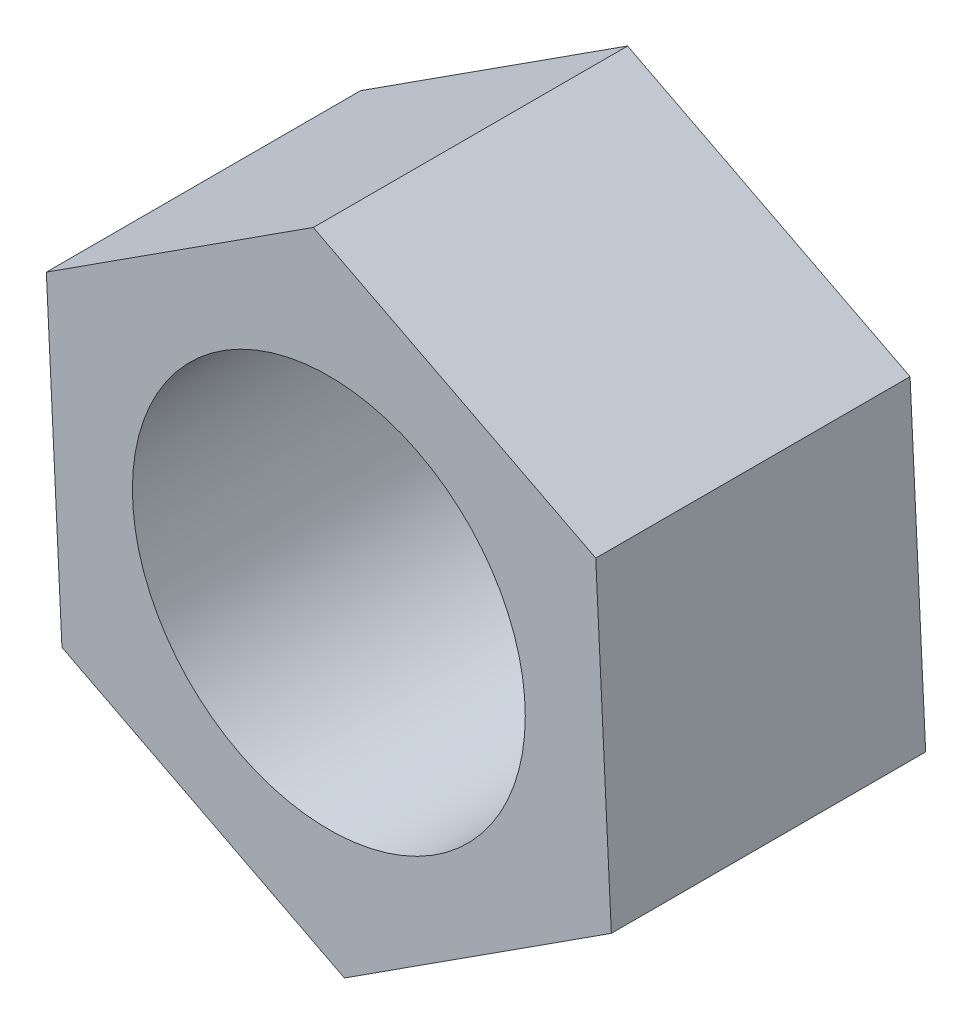
ISO-10303-21;
HEADER;
FILE_DESCRIPTION(('STEP AP214'),'2;1');
FILE_NAME('part.step','',(''),(''),'','','');
FILE_SCHEMA(('AUTOMOTIVE_DESIGN { 1 0 10303 214 1 1 1 1 }'));
ENDSEC;
DATA;
#1=APPLICATION_CONTEXT('core data for automotive mechanical design processes');
#2=APPLICATION_PROTOCOL_DEFINITION('international standard','automotive_design',2000,#1);
#3=PRODUCT_CONTEXT('',#1,'mechanical');
#4=PRODUCT('Part','Part','',(#3));
#5=PRODUCT_RELATED_PRODUCT_CATEGORY('part','',(#4));
#6=PRODUCT_DEFINITION_FORMATION('','',#4);
#7=PRODUCT_DEFINITION_CONTEXT('part definition',#1,'design');
#8=PRODUCT_DEFINITION('design','',#6,#7);
#9=PRODUCT_DEFINITION_SHAPE('','',#8);
#10=(LENGTH_UNIT() NAMED_UNIT(*) SI_UNIT(.MILLI.,.METRE.));
#11=(NAMED_UNIT(*) PLANE_ANGLE_UNIT() SI_UNIT($,.RADIAN.));
#12=(NAMED_UNIT(*) SI_UNIT($,.STERADIAN.) SOLID_ANGLE_UNIT());
#13=UNCERTAINTY_MEASURE_WITH_UNIT(LENGTH_MEASURE(1.E-05),#10,'distance_accuracy_value','');
#14=(GEOMETRIC_REPRESENTATION_CONTEXT(3) GLOBAL_UNCERTAINTY_ASSIGNED_CONTEXT((#13)) GLOBAL_UNIT_ASSIGNED_CONTEXT((#10,
#11,#12)) REPRESENTATION_CONTEXT('',''));
#15=CARTESIAN_POINT('',(0.,0.,0.));
#16=DIRECTION('',(0.,0.,1.));
#17=DIRECTION('',(1.,0.,0.));
#18=AXIS2_PLACEMENT_3D('',#15,#16,#17);
#19=CARTESIAN_POINT('',(0.,0.,4.));
#20=DIRECTION('',(0.,0.,1.));
#21=DIRECTION('',(1.,0.,0.));
#22=AXIS2_PLACEMENT_3D('',#19,#20,#21);
#23=PLANE('',#22);
#24=DIRECTION('',(-0.889518854990785,0.456898464230165,0.));
#25=VECTOR('',#24,1.);
#26=CARTESIAN_POINT('',(3.3966184511292,2.1900494128631,4.));
#27=LINE('',#26,#25);
#28=CARTESIAN_POINT('',(3.3966184511292,2.1900494128631,4.));
#29=VERTEX_POINT('',#28);
#30=CARTESIAN_POINT('',(-0.198329201518042,4.03658257207239,4.));
#31=VERTEX_POINT('',#30);
#32=EDGE_CURVE('E130',#29,#31,#27,.T.);
#33=ORIENTED_EDGE('',*,*,#32,.T.);
#34=DIRECTION('',(-0.840445104468811,-0.541896693452183,0.));
#35=VECTOR('',#34,1.);
#36=CARTESIAN_POINT('',(-0.198329201518042,4.03658257207239,4.));
#37=LINE('',#36,#35);
#38=CARTESIAN_POINT('',(-3.59494765264724,1.84653315920929,4.));
#39=VERTEX_POINT('',#38);
#40=EDGE_CURVE('E88',#31,#39,#37,.T.);
#41=ORIENTED_EDGE('',*,*,#40,.T.);
#42=DIRECTION('',(0.0490737505219734,-0.998795157682349,0.));
#43=VECTOR('',#42,1.);
#44=CARTESIAN_POINT('',(-3.59494765264724,1.84653315920929,4.));
#45=LINE('',#44,#43);
#46=CARTESIAN_POINT('',(-3.3966184511292,-2.1900494128631,4.));
#47=VERTEX_POINT('',#46);
#48=EDGE_CURVE('E101',#39,#47,#45,.T.);
#49=ORIENTED_EDGE('',*,*,#48,.T.);
#50=DIRECTION('',(0.889518854990785,-0.456898464230166,0.));
#51=VECTOR('',#50,1.);
#52=CARTESIAN_POINT('',(-3.3966184511292,-2.1900494128631,4.));
#53=LINE('',#52,#51);
#54=CARTESIAN_POINT('',(0.19832920151804,-4.03658257207239,4.));
#55=VERTEX_POINT('',#54);
#56=EDGE_CURVE('E95',#47,#55,#53,.T.);
#57=ORIENTED_EDGE('',*,*,#56,.T.);
#58=DIRECTION('',(0.840445104468811,0.541896693452183,0.));
#59=VECTOR('',#58,1.);
#60=CARTESIAN_POINT('',(0.19832920151804,-4.03658257207239,4.));
#61=LINE('',#60,#59);
#62=CARTESIAN_POINT('',(3.59494765264724,-1.84653315920929,4.));
#63=VERTEX_POINT('',#62);
#64=EDGE_CURVE('E99',#55,#63,#61,.T.);
#65=ORIENTED_EDGE('',*,*,#64,.T.);
#66=DIRECTION('',(-0.0490737505219735,0.998795157682349,0.));
#67=VECTOR('',#66,1.);
#68=CARTESIAN_POINT('',(3.59494765264724,-1.84653315920929,4.));
#69=LINE('',#68,#67);
#70=EDGE_CURVE('E51',#63,#29,#69,.T.);
#71=ORIENTED_EDGE('',*,*,#70,.T.);
#72=EDGE_LOOP('',(#33,#41,#49,#57,#65,#71));
#73=FACE_BOUND('',#72,.T.);
#74=CARTESIAN_POINT('',(0.,0.,4.));
#75=DIRECTION('',(0.,0.,1.));
#76=DIRECTION('',(1.,0.,0.));
#77=AXIS2_PLACEMENT_3D('',#74,#75,#76);
#78=CIRCLE('',#77,2.5);
#79=CARTESIAN_POINT('',(2.5,0.,4.));
#80=VERTEX_POINT('',#79);
#81=EDGE_CURVE('E123',#80,#80,#78,.T.);
#82=ORIENTED_EDGE('',*,*,#81,.F.);
#83=EDGE_LOOP('',(#82));
#84=FACE_BOUND('',#83,.T.);
#85=ADVANCED_FACE('F34',(#73,#84),#23,.T.);
#86=CARTESIAN_POINT('',(0.,0.,0.));
#87=DIRECTION('',(0.,0.,1.));
#88=DIRECTION('',(1.,0.,0.));
#89=AXIS2_PLACEMENT_3D('',#86,#87,#88);
#90=PLANE('',#89);
#91=DIRECTION('',(-0.889518854990785,0.456898464230165,0.));
#92=VECTOR('',#91,1.);
#93=CARTESIAN_POINT('',(3.3966184511292,2.1900494128631,0.));
#94=LINE('',#93,#92);
#95=CARTESIAN_POINT('',(3.3966184511292,2.1900494128631,0.));
#96=VERTEX_POINT('',#95);
#97=CARTESIAN_POINT('',(-0.198329201518042,4.03658257207239,0.));
#98=VERTEX_POINT('',#97);
#99=EDGE_CURVE('E119',#96,#98,#94,.T.);
#100=ORIENTED_EDGE('',*,*,#99,.F.);
#101=DIRECTION('',(-0.0490737505219735,0.998795157682349,0.));
#102=VECTOR('',#101,1.);
#103=CARTESIAN_POINT('',(3.59494765264724,-1.84653315920929,0.));
#104=LINE('',#103,#102);
#105=CARTESIAN_POINT('',(3.59494765264724,-1.84653315920929,0.));
#106=VERTEX_POINT('',#105);
#107=EDGE_CURVE('E80',#106,#96,#104,.T.);
#108=ORIENTED_EDGE('',*,*,#107,.F.);
#109=DIRECTION('',(0.840445104468811,0.541896693452183,0.));
#110=VECTOR('',#109,1.);
#111=CARTESIAN_POINT('',(0.19832920151804,-4.03658257207239,0.));
#112=LINE('',#111,#110);
#113=CARTESIAN_POINT('',(0.19832920151804,-4.03658257207239,0.));
#114=VERTEX_POINT('',#113);
#115=EDGE_CURVE('E74',#114,#106,#112,.T.);
#116=ORIENTED_EDGE('',*,*,#115,.F.);
#117=DIRECTION('',(0.889518854990785,-0.456898464230166,0.));
#118=VECTOR('',#117,1.);
#119=CARTESIAN_POINT('',(-3.3966184511292,-2.1900494128631,0.));
#120=LINE('',#119,#118);
#121=CARTESIAN_POINT('',(-3.3966184511292,-2.1900494128631,0.));
#122=VERTEX_POINT('',#121);
#123=EDGE_CURVE('E109',#122,#114,#120,.T.);
#124=ORIENTED_EDGE('',*,*,#123,.F.);
#125=DIRECTION('',(0.0490737505219734,-0.998795157682349,0.));
#126=VECTOR('',#125,1.);
#127=CARTESIAN_POINT('',(-3.59494765264724,1.84653315920929,0.));
#128=LINE('',#127,#126);
#129=CARTESIAN_POINT('',(-3.59494765264724,1.84653315920929,0.));
#130=VERTEX_POINT('',#129);
#131=EDGE_CURVE('E125',#130,#122,#128,.T.);
#132=ORIENTED_EDGE('',*,*,#131,.F.);
#133=DIRECTION('',(-0.840445104468811,-0.541896693452183,0.));
#134=VECTOR('',#133,1.);
#135=CARTESIAN_POINT('',(-0.198329201518042,4.03658257207239,0.));
#136=LINE('',#135,#134);
#137=EDGE_CURVE('E122',#98,#130,#136,.T.);
#138=ORIENTED_EDGE('',*,*,#137,.F.);
#139=EDGE_LOOP('',(#100,#108,#116,#124,#132,#138));
#140=FACE_BOUND('',#139,.T.);
#141=CARTESIAN_POINT('',(0.,0.,0.));
#142=DIRECTION('',(0.,0.,1.));
#143=DIRECTION('',(1.,0.,0.));
#144=AXIS2_PLACEMENT_3D('',#141,#142,#143);
#145=CIRCLE('',#144,2.5);
#146=CARTESIAN_POINT('',(2.5,0.,0.));
#147=VERTEX_POINT('',#146);
#148=EDGE_CURVE('E223',#147,#147,#145,.T.);
#149=ORIENTED_EDGE('',*,*,#148,.T.);
#150=EDGE_LOOP('',(#149));
#151=FACE_BOUND('',#150,.T.);
#152=ADVANCED_FACE('F139',(#140,#151),#90,.F.);
#153=CARTESIAN_POINT('',(3.3966184511292,2.1900494128631,4.));
#154=DIRECTION('',(-0.456898464230165,-0.889518854990785,0.));
#155=DIRECTION('',(0.889518854990785,-0.456898464230165,0.));
#156=AXIS2_PLACEMENT_3D('',#153,#154,#155);
#157=PLANE('',#156);
#158=ORIENTED_EDGE('',*,*,#99,.T.);
#159=DIRECTION('',(0.,0.,-1.));
#160=VECTOR('',#159,1.);
#161=CARTESIAN_POINT('',(-0.198329201518042,4.03658257207239,4.));
#162=LINE('',#161,#160);
#163=EDGE_CURVE('E11',#31,#98,#162,.T.);
#164=ORIENTED_EDGE('',*,*,#163,.F.);
#165=ORIENTED_EDGE('',*,*,#32,.F.);
#166=DIRECTION('',(0.,0.,-1.));
#167=VECTOR('',#166,1.);
#168=CARTESIAN_POINT('',(3.3966184511292,2.1900494128631,4.));
#169=LINE('',#168,#167);
#170=EDGE_CURVE('E115',#29,#96,#169,.T.);
#171=ORIENTED_EDGE('',*,*,#170,.T.);
#172=EDGE_LOOP('',(#158,#164,#165,#171));
#173=FACE_BOUND('',#172,.T.);
#174=ADVANCED_FACE('F36',(#173),#157,.F.);
#175=CARTESIAN_POINT('',(-0.198329201518042,4.03658257207239,4.));
#176=DIRECTION('',(0.541896693452183,-0.840445104468811,0.));
#177=DIRECTION('',(0.840445104468811,0.541896693452183,0.));
#178=AXIS2_PLACEMENT_3D('',#175,#176,#177);
#179=PLANE('',#178);
#180=ORIENTED_EDGE('',*,*,#137,.T.);
#181=DIRECTION('',(0.,0.,-1.));
#182=VECTOR('',#181,1.);
#183=CARTESIAN_POINT('',(-3.59494765264724,1.84653315920929,4.));
#184=LINE('',#183,#182);
#185=EDGE_CURVE('E43',#39,#130,#184,.T.);
#186=ORIENTED_EDGE('',*,*,#185,.F.);
#187=ORIENTED_EDGE('',*,*,#40,.F.);
#188=ORIENTED_EDGE('',*,*,#163,.T.);
#189=EDGE_LOOP('',(#180,#186,#187,#188));
#190=FACE_BOUND('',#189,.T.);
#191=ADVANCED_FACE('F164',(#190),#179,.F.);
#192=CARTESIAN_POINT('',(-3.59494765264724,1.84653315920929,4.));
#193=DIRECTION('',(0.998795157682348,0.0490737505219734,0.));
#194=DIRECTION('',(-0.0490737505219734,0.998795157682349,0.));
#195=AXIS2_PLACEMENT_3D('',#192,#193,#194);
#196=PLANE('',#195);
#197=ORIENTED_EDGE('',*,*,#131,.T.);
#198=DIRECTION('',(0.,0.,-1.));
#199=VECTOR('',#198,1.);
#200=CARTESIAN_POINT('',(-3.3966184511292,-2.1900494128631,4.));
#201=LINE('',#200,#199);
#202=EDGE_CURVE('E110',#47,#122,#201,.T.);
#203=ORIENTED_EDGE('',*,*,#202,.F.);
#204=ORIENTED_EDGE('',*,*,#48,.F.);
#205=ORIENTED_EDGE('',*,*,#185,.T.);
#206=EDGE_LOOP('',(#197,#203,#204,#205));
#207=FACE_BOUND('',#206,.T.);
#208=ADVANCED_FACE('F136',(#207),#196,.F.);
#209=CARTESIAN_POINT('',(-3.3966184511292,-2.1900494128631,4.));
#210=DIRECTION('',(0.456898464230166,0.889518854990785,0.));
#211=DIRECTION('',(-0.889518854990785,0.456898464230166,0.));
#212=AXIS2_PLACEMENT_3D('',#209,#210,#211);
#213=PLANE('',#212);
#214=ORIENTED_EDGE('',*,*,#123,.T.);
#215=DIRECTION('',(0.,0.,-1.));
#216=VECTOR('',#215,1.);
#217=CARTESIAN_POINT('',(0.19832920151804,-4.03658257207239,4.));
#218=LINE('',#217,#216);
#219=EDGE_CURVE('E106',#55,#114,#218,.T.);
#220=ORIENTED_EDGE('',*,*,#219,.F.);
#221=ORIENTED_EDGE('',*,*,#56,.F.);
#222=ORIENTED_EDGE('',*,*,#202,.T.);
#223=EDGE_LOOP('',(#214,#220,#221,#222));
#224=FACE_BOUND('',#223,.T.);
#225=ADVANCED_FACE('F107',(#224),#213,.F.);
#226=CARTESIAN_POINT('',(0.19832920151804,-4.03658257207239,4.));
#227=DIRECTION('',(-0.541896693452183,0.840445104468811,0.));
#228=DIRECTION('',(-0.840445104468811,-0.541896693452183,0.));
#229=AXIS2_PLACEMENT_3D('',#226,#227,#228);
#230=PLANE('',#229);
#231=ORIENTED_EDGE('',*,*,#115,.T.);
#232=DIRECTION('',(0.,0.,-1.));
#233=VECTOR('',#232,1.);
#234=CARTESIAN_POINT('',(3.59494765264724,-1.84653315920929,4.));
#235=LINE('',#234,#233);
#236=EDGE_CURVE('E111',#63,#106,#235,.T.);
#237=ORIENTED_EDGE('',*,*,#236,.F.);
#238=ORIENTED_EDGE('',*,*,#64,.F.);
#239=ORIENTED_EDGE('',*,*,#219,.T.);
#240=EDGE_LOOP('',(#231,#237,#238,#239));
#241=FACE_BOUND('',#240,.T.);
#242=ADVANCED_FACE('F113',(#241),#230,.F.);
#243=CARTESIAN_POINT('',(3.59494765264724,-1.84653315920929,4.));
#244=DIRECTION('',(-0.998795157682348,-0.0490737505219735,0.));
#245=DIRECTION('',(0.0490737505219735,-0.998795157682349,0.));
#246=AXIS2_PLACEMENT_3D('',#243,#244,#245);
#247=PLANE('',#246);
#248=ORIENTED_EDGE('',*,*,#107,.T.);
#249=ORIENTED_EDGE('',*,*,#170,.F.);
#250=ORIENTED_EDGE('',*,*,#70,.F.);
#251=ORIENTED_EDGE('',*,*,#236,.T.);
#252=EDGE_LOOP('',(#248,#249,#250,#251));
#253=FACE_BOUND('',#252,.T.);
#254=ADVANCED_FACE('F144',(#253),#247,.F.);
#255=CARTESIAN_POINT('',(0.,0.,4.));
#256=DIRECTION('',(0.,0.,-1.));
#257=DIRECTION('',(-1.,0.,0.));
#258=AXIS2_PLACEMENT_3D('',#255,#256,#257);
#259=CYLINDRICAL_SURFACE('',#258,2.5);
#260=ORIENTED_EDGE('',*,*,#81,.T.);
#261=EDGE_LOOP('',(#260));
#262=FACE_BOUND('',#261,.T.);
#263=ORIENTED_EDGE('',*,*,#148,.F.);
#264=EDGE_LOOP('',(#263));
#265=FACE_BOUND('',#264,.T.);
#266=ADVANCED_FACE('F146',(#262,#265),#259,.F.);
#267=CLOSED_SHELL('',(#85,#152,#174,#191,#208,#225,#242,#254,#266));
#268=MANIFOLD_SOLID_BREP('B2',#267);
#269=ADVANCED_BREP_SHAPE_REPRESENTATION('',(#18,#268),#14);
#270=SHAPE_DEFINITION_REPRESENTATION(#9,#269);
ENDSEC;
END-ISO-10303-21;
